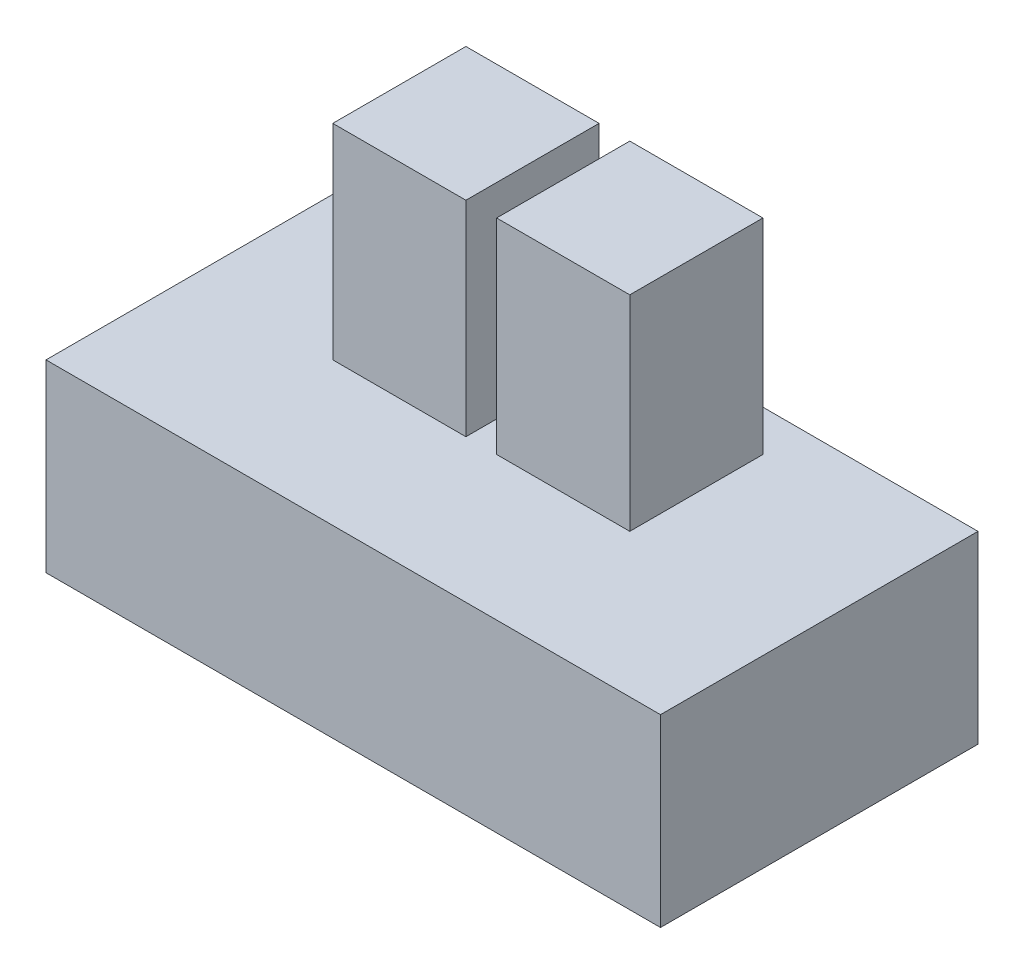
ISO-10303-21;
HEADER;
FILE_DESCRIPTION(('STEP AP214'),'2;1');
FILE_NAME('part.step','',(''),(''),'','','');
FILE_SCHEMA(('AUTOMOTIVE_DESIGN { 1 0 10303 214 1 1 1 1 }'));
ENDSEC;
DATA;
#1=APPLICATION_CONTEXT('core data for automotive mechanical design processes');
#2=APPLICATION_PROTOCOL_DEFINITION('international standard','automotive_design',2000,#1);
#3=PRODUCT_CONTEXT('',#1,'mechanical');
#4=PRODUCT('Part','Part','',(#3));
#5=PRODUCT_RELATED_PRODUCT_CATEGORY('part','',(#4));
#6=PRODUCT_DEFINITION_FORMATION('','',#4);
#7=PRODUCT_DEFINITION_CONTEXT('part definition',#1,'design');
#8=PRODUCT_DEFINITION('design','',#6,#7);
#9=PRODUCT_DEFINITION_SHAPE('','',#8);
#10=(LENGTH_UNIT() NAMED_UNIT(*) SI_UNIT(.MILLI.,.METRE.));
#11=(NAMED_UNIT(*) PLANE_ANGLE_UNIT() SI_UNIT($,.RADIAN.));
#12=(NAMED_UNIT(*) SI_UNIT($,.STERADIAN.) SOLID_ANGLE_UNIT());
#13=UNCERTAINTY_MEASURE_WITH_UNIT(LENGTH_MEASURE(1.E-05),#10,'distance_accuracy_value','');
#14=(GEOMETRIC_REPRESENTATION_CONTEXT(3) GLOBAL_UNCERTAINTY_ASSIGNED_CONTEXT((#13)) GLOBAL_UNIT_ASSIGNED_CONTEXT((#10,
#11,#12)) REPRESENTATION_CONTEXT('',''));
#15=CARTESIAN_POINT('',(0.,0.,0.));
#16=DIRECTION('',(0.,0.,1.));
#17=DIRECTION('',(1.,0.,0.));
#18=AXIS2_PLACEMENT_3D('',#15,#16,#17);
#19=CARTESIAN_POINT('',(0.,18.,0.));
#20=DIRECTION('',(0.,1.,0.));
#21=DIRECTION('',(0.,0.,1.));
#22=AXIS2_PLACEMENT_3D('',#19,#20,#21);
#23=PLANE('',#22);
#24=DIRECTION('',(1.,0.,0.));
#25=VECTOR('',#24,1.);
#26=CARTESIAN_POINT('',(-26.8070343531532,18.,8.11477990751526));
#27=LINE('',#26,#25);
#28=CARTESIAN_POINT('',(-26.8070343531532,18.,8.11477990751526));
#29=VERTEX_POINT('',#28);
#30=CARTESIAN_POINT('',(-13.8070343531532,18.,8.11477990751526));
#31=VERTEX_POINT('',#30);
#32=EDGE_CURVE('E395',#29,#31,#27,.T.);
#33=ORIENTED_EDGE('',*,*,#32,.F.);
#34=DIRECTION('',(0.,0.,1.));
#35=VECTOR('',#34,1.);
#36=CARTESIAN_POINT('',(-26.8070343531532,18.,-4.88522009248474));
#37=LINE('',#36,#35);
#38=CARTESIAN_POINT('',(-26.8070343531532,18.,-4.88522009248474));
#39=VERTEX_POINT('',#38);
#40=EDGE_CURVE('E381',#39,#29,#37,.T.);
#41=ORIENTED_EDGE('',*,*,#40,.F.);
#42=DIRECTION('',(-1.,0.,0.));
#43=VECTOR('',#42,1.);
#44=CARTESIAN_POINT('',(-26.8070343531532,18.,-4.88522009248474));
#45=LINE('',#44,#43);
#46=CARTESIAN_POINT('',(-13.8070343531532,18.,-4.88522009248474));
#47=VERTEX_POINT('',#46);
#48=EDGE_CURVE('E386',#47,#39,#45,.T.);
#49=ORIENTED_EDGE('',*,*,#48,.F.);
#50=DIRECTION('',(0.,0.,-1.));
#51=VECTOR('',#50,1.);
#52=CARTESIAN_POINT('',(-13.8070343531532,18.,-4.88522009248474));
#53=LINE('',#52,#51);
#54=EDGE_CURVE('E397',#31,#47,#53,.T.);
#55=ORIENTED_EDGE('',*,*,#54,.F.);
#56=EDGE_LOOP('',(#33,#41,#49,#55));
#57=FACE_BOUND('',#56,.T.);
#58=DIRECTION('',(0.,0.,1.));
#59=VECTOR('',#58,1.);
#60=CARTESIAN_POINT('',(-40.8070343531532,18.,-8.88522009248474));
#61=LINE('',#60,#59);
#62=CARTESIAN_POINT('',(-40.8070343531532,18.,-8.88522009248474));
#63=VERTEX_POINT('',#62);
#64=CARTESIAN_POINT('',(-40.8070343531532,18.,22.1147799075153));
#65=VERTEX_POINT('',#64);
#66=EDGE_CURVE('E411',#63,#65,#61,.T.);
#67=ORIENTED_EDGE('',*,*,#66,.T.);
#68=DIRECTION('',(1.,0.,0.));
#69=VECTOR('',#68,1.);
#70=CARTESIAN_POINT('',(-40.8070343531532,18.,22.1147799075153));
#71=LINE('',#70,#69);
#72=CARTESIAN_POINT('',(19.1929656468468,18.,22.1147799075153));
#73=VERTEX_POINT('',#72);
#74=EDGE_CURVE('E414',#65,#73,#71,.T.);
#75=ORIENTED_EDGE('',*,*,#74,.T.);
#76=DIRECTION('',(0.,0.,-1.));
#77=VECTOR('',#76,1.);
#78=CARTESIAN_POINT('',(19.1929656468468,18.,-8.88522009248474));
#79=LINE('',#78,#77);
#80=CARTESIAN_POINT('',(19.1929656468468,18.,-8.88522009248474));
#81=VERTEX_POINT('',#80);
#82=EDGE_CURVE('E417',#73,#81,#79,.T.);
#83=ORIENTED_EDGE('',*,*,#82,.T.);
#84=DIRECTION('',(-1.,0.,0.));
#85=VECTOR('',#84,1.);
#86=CARTESIAN_POINT('',(-40.8070343531532,18.,-8.88522009248474));
#87=LINE('',#86,#85);
#88=EDGE_CURVE('E419',#81,#63,#87,.T.);
#89=ORIENTED_EDGE('',*,*,#88,.T.);
#90=EDGE_LOOP('',(#67,#75,#83,#89));
#91=FACE_BOUND('',#90,.T.);
#92=DIRECTION('',(1.,0.,0.));
#93=VECTOR('',#92,1.);
#94=CARTESIAN_POINT('',(-10.8070343531532,18.,8.11477990751526));
#95=LINE('',#94,#93);
#96=CARTESIAN_POINT('',(-10.8070343531532,18.,8.11477990751526));
#97=VERTEX_POINT('',#96);
#98=CARTESIAN_POINT('',(2.19296564684683,18.,8.11477990751526));
#99=VERTEX_POINT('',#98);
#100=EDGE_CURVE('E366',#97,#99,#95,.T.);
#101=ORIENTED_EDGE('',*,*,#100,.F.);
#102=DIRECTION('',(0.,0.,1.));
#103=VECTOR('',#102,1.);
#104=CARTESIAN_POINT('',(-10.8070343531532,18.,-4.88522009248474));
#105=LINE('',#104,#103);
#106=CARTESIAN_POINT('',(-10.8070343531532,18.,-4.88522009248474));
#107=VERTEX_POINT('',#106);
#108=EDGE_CURVE('E346',#107,#97,#105,.T.);
#109=ORIENTED_EDGE('',*,*,#108,.F.);
#110=DIRECTION('',(-1.,0.,0.));
#111=VECTOR('',#110,1.);
#112=CARTESIAN_POINT('',(-10.8070343531532,18.,-4.88522009248474));
#113=LINE('',#112,#111);
#114=CARTESIAN_POINT('',(2.19296564684683,18.,-4.88522009248474));
#115=VERTEX_POINT('',#114);
#116=EDGE_CURVE('E357',#115,#107,#113,.T.);
#117=ORIENTED_EDGE('',*,*,#116,.F.);
#118=DIRECTION('',(0.,0.,-1.));
#119=VECTOR('',#118,1.);
#120=CARTESIAN_POINT('',(2.19296564684683,18.,-4.88522009248474));
#121=LINE('',#120,#119);
#122=EDGE_CURVE('E368',#99,#115,#121,.T.);
#123=ORIENTED_EDGE('',*,*,#122,.F.);
#124=EDGE_LOOP('',(#101,#109,#117,#123));
#125=FACE_BOUND('',#124,.T.);
#126=ADVANCED_FACE('F35',(#57,#91,#125),#23,.T.);
#127=CARTESIAN_POINT('',(-40.8070343531532,18.,-8.88522009248474));
#128=DIRECTION('',(1.,0.,0.));
#129=DIRECTION('',(0.,0.,-1.));
#130=AXIS2_PLACEMENT_3D('',#127,#128,#129);
#131=PLANE('',#130);
#132=DIRECTION('',(0.,0.,1.));
#133=VECTOR('',#132,1.);
#134=CARTESIAN_POINT('',(-40.8070343531532,6.,14.6147799075153));
#135=LINE('',#134,#133);
#136=CARTESIAN_POINT('',(-40.8070343531532,6.,14.6147799075153));
#137=VERTEX_POINT('',#136);
#138=CARTESIAN_POINT('',(-40.8070343531532,6.,17.6147799075153));
#139=VERTEX_POINT('',#138);
#140=EDGE_CURVE('E249',#137,#139,#135,.T.);
#141=ORIENTED_EDGE('',*,*,#140,.F.);
#142=DIRECTION('',(0.,-1.,0.));
#143=VECTOR('',#142,1.);
#144=CARTESIAN_POINT('',(-40.8070343531532,9.,14.6147799075153));
#145=LINE('',#144,#143);
#146=CARTESIAN_POINT('',(-40.8070343531532,9.,14.6147799075153));
#147=VERTEX_POINT('',#146);
#148=EDGE_CURVE('E50',#147,#137,#145,.T.);
#149=ORIENTED_EDGE('',*,*,#148,.F.);
#150=DIRECTION('',(0.,0.,-1.));
#151=VECTOR('',#150,1.);
#152=CARTESIAN_POINT('',(-40.8070343531532,9.,14.6147799075153));
#153=LINE('',#152,#151);
#154=CARTESIAN_POINT('',(-40.8070343531532,9.,17.6147799075153));
#155=VERTEX_POINT('',#154);
#156=EDGE_CURVE('E240',#155,#147,#153,.T.);
#157=ORIENTED_EDGE('',*,*,#156,.F.);
#158=DIRECTION('',(0.,1.,0.));
#159=VECTOR('',#158,1.);
#160=CARTESIAN_POINT('',(-40.8070343531532,9.,17.6147799075153));
#161=LINE('',#160,#159);
#162=EDGE_CURVE('E243',#139,#155,#161,.T.);
#163=ORIENTED_EDGE('',*,*,#162,.F.);
#164=EDGE_LOOP('',(#141,#149,#157,#163));
#165=FACE_BOUND('',#164,.T.);
#166=DIRECTION('',(0.,0.,1.));
#167=VECTOR('',#166,1.);
#168=CARTESIAN_POINT('',(-40.8070343531532,6.,9.11477990751526));
#169=LINE('',#168,#167);
#170=CARTESIAN_POINT('',(-40.8070343531532,6.,9.11477990751526));
#171=VERTEX_POINT('',#170);
#172=CARTESIAN_POINT('',(-40.8070343531532,6.,12.1147799075153));
#173=VERTEX_POINT('',#172);
#174=EDGE_CURVE('E273',#171,#173,#169,.T.);
#175=ORIENTED_EDGE('',*,*,#174,.F.);
#176=DIRECTION('',(0.,-1.,0.));
#177=VECTOR('',#176,1.);
#178=CARTESIAN_POINT('',(-40.8070343531532,9.,9.11477990751526));
#179=LINE('',#178,#177);
#180=CARTESIAN_POINT('',(-40.8070343531532,9.,9.11477990751526));
#181=VERTEX_POINT('',#180);
#182=EDGE_CURVE('E58',#181,#171,#179,.T.);
#183=ORIENTED_EDGE('',*,*,#182,.F.);
#184=DIRECTION('',(0.,0.,-1.));
#185=VECTOR('',#184,1.);
#186=CARTESIAN_POINT('',(-40.8070343531532,9.,9.11477990751526));
#187=LINE('',#186,#185);
#188=CARTESIAN_POINT('',(-40.8070343531532,9.,12.1147799075153));
#189=VERTEX_POINT('',#188);
#190=EDGE_CURVE('E262',#189,#181,#187,.T.);
#191=ORIENTED_EDGE('',*,*,#190,.F.);
#192=DIRECTION('',(0.,1.,0.));
#193=VECTOR('',#192,1.);
#194=CARTESIAN_POINT('',(-40.8070343531532,9.,12.1147799075153));
#195=LINE('',#194,#193);
#196=EDGE_CURVE('E276',#173,#189,#195,.T.);
#197=ORIENTED_EDGE('',*,*,#196,.F.);
#198=EDGE_LOOP('',(#175,#183,#191,#197));
#199=FACE_BOUND('',#198,.T.);
#200=DIRECTION('',(0.,0.,1.));
#201=VECTOR('',#200,1.);
#202=CARTESIAN_POINT('',(-40.8070343531532,6.,1.11477990751526));
#203=LINE('',#202,#201);
#204=CARTESIAN_POINT('',(-40.8070343531532,6.,1.11477990751526));
#205=VERTEX_POINT('',#204);
#206=CARTESIAN_POINT('',(-40.8070343531532,6.,4.11477990751526));
#207=VERTEX_POINT('',#206);
#208=EDGE_CURVE('E304',#205,#207,#203,.T.);
#209=ORIENTED_EDGE('',*,*,#208,.F.);
#210=DIRECTION('',(0.,-1.,0.));
#211=VECTOR('',#210,1.);
#212=CARTESIAN_POINT('',(-40.8070343531532,9.,1.11477990751526));
#213=LINE('',#212,#211);
#214=CARTESIAN_POINT('',(-40.8070343531532,9.,1.11477990751526));
#215=VERTEX_POINT('',#214);
#216=EDGE_CURVE('E283',#215,#205,#213,.T.);
#217=ORIENTED_EDGE('',*,*,#216,.F.);
#218=DIRECTION('',(0.,0.,-1.));
#219=VECTOR('',#218,1.);
#220=CARTESIAN_POINT('',(-40.8070343531532,9.,1.11477990751526));
#221=LINE('',#220,#219);
#222=CARTESIAN_POINT('',(-40.8070343531532,9.,4.11477990751526));
#223=VERTEX_POINT('',#222);
#224=EDGE_CURVE('E293',#223,#215,#221,.T.);
#225=ORIENTED_EDGE('',*,*,#224,.F.);
#226=DIRECTION('',(0.,1.,0.));
#227=VECTOR('',#226,1.);
#228=CARTESIAN_POINT('',(-40.8070343531532,9.,4.11477990751526));
#229=LINE('',#228,#227);
#230=EDGE_CURVE('E307',#207,#223,#229,.T.);
#231=ORIENTED_EDGE('',*,*,#230,.F.);
#232=EDGE_LOOP('',(#209,#217,#225,#231));
#233=FACE_BOUND('',#232,.T.);
#234=DIRECTION('',(0.,0.,1.));
#235=VECTOR('',#234,1.);
#236=CARTESIAN_POINT('',(-40.8070343531532,6.,-4.38522009248475));
#237=LINE('',#236,#235);
#238=CARTESIAN_POINT('',(-40.8070343531532,6.,-4.38522009248475));
#239=VERTEX_POINT('',#238);
#240=CARTESIAN_POINT('',(-40.8070343531532,6.,-1.38522009248474));
#241=VERTEX_POINT('',#240);
#242=EDGE_CURVE('E336',#239,#241,#237,.T.);
#243=ORIENTED_EDGE('',*,*,#242,.F.);
#244=DIRECTION('',(0.,-1.,0.));
#245=VECTOR('',#244,1.);
#246=CARTESIAN_POINT('',(-40.8070343531532,9.,-4.38522009248475));
#247=LINE('',#246,#245);
#248=CARTESIAN_POINT('',(-40.8070343531532,9.,-4.38522009248475));
#249=VERTEX_POINT('',#248);
#250=EDGE_CURVE('E314',#249,#239,#247,.T.);
#251=ORIENTED_EDGE('',*,*,#250,.F.);
#252=DIRECTION('',(0.,0.,-1.));
#253=VECTOR('',#252,1.);
#254=CARTESIAN_POINT('',(-40.8070343531532,9.,-4.38522009248475));
#255=LINE('',#254,#253);
#256=CARTESIAN_POINT('',(-40.8070343531532,9.,-1.38522009248474));
#257=VERTEX_POINT('',#256);
#258=EDGE_CURVE('E325',#257,#249,#255,.T.);
#259=ORIENTED_EDGE('',*,*,#258,.F.);
#260=DIRECTION('',(0.,1.,0.));
#261=VECTOR('',#260,1.);
#262=CARTESIAN_POINT('',(-40.8070343531532,9.,-1.38522009248474));
#263=LINE('',#262,#261);
#264=EDGE_CURVE('E339',#241,#257,#263,.T.);
#265=ORIENTED_EDGE('',*,*,#264,.F.);
#266=EDGE_LOOP('',(#243,#251,#259,#265));
#267=FACE_BOUND('',#266,.T.);
#268=DIRECTION('',(0.,0.,1.));
#269=VECTOR('',#268,1.);
#270=CARTESIAN_POINT('',(-40.8070343531532,0.,-8.88522009248474));
#271=LINE('',#270,#269);
#272=CARTESIAN_POINT('',(-40.8070343531532,0.,-8.88522009248474));
#273=VERTEX_POINT('',#272);
#274=CARTESIAN_POINT('',(-40.8070343531532,0.,22.1147799075153));
#275=VERTEX_POINT('',#274);
#276=EDGE_CURVE('E410',#273,#275,#271,.T.);
#277=ORIENTED_EDGE('',*,*,#276,.T.);
#278=DIRECTION('',(0.,-1.,0.));
#279=VECTOR('',#278,1.);
#280=CARTESIAN_POINT('',(-40.8070343531532,18.,22.1147799075153));
#281=LINE('',#280,#279);
#282=EDGE_CURVE('E11',#65,#275,#281,.T.);
#283=ORIENTED_EDGE('',*,*,#282,.F.);
#284=ORIENTED_EDGE('',*,*,#66,.F.);
#285=DIRECTION('',(0.,-1.,0.));
#286=VECTOR('',#285,1.);
#287=CARTESIAN_POINT('',(-40.8070343531532,18.,-8.88522009248474));
#288=LINE('',#287,#286);
#289=EDGE_CURVE('E421',#63,#273,#288,.T.);
#290=ORIENTED_EDGE('',*,*,#289,.T.);
#291=EDGE_LOOP('',(#277,#283,#284,#290));
#292=FACE_BOUND('',#291,.T.);
#293=ADVANCED_FACE('F37',(#165,#199,#233,#267,#292),#131,.F.);
#294=CARTESIAN_POINT('',(-40.8070343531532,18.,22.1147799075153));
#295=DIRECTION('',(0.,0.,-1.));
#296=DIRECTION('',(-1.,0.,0.));
#297=AXIS2_PLACEMENT_3D('',#294,#295,#296);
#298=PLANE('',#297);
#299=DIRECTION('',(1.,0.,0.));
#300=VECTOR('',#299,1.);
#301=CARTESIAN_POINT('',(-40.8070343531532,0.,22.1147799075153));
#302=LINE('',#301,#300);
#303=CARTESIAN_POINT('',(19.1929656468468,0.,22.1147799075153));
#304=VERTEX_POINT('',#303);
#305=EDGE_CURVE('E424',#275,#304,#302,.T.);
#306=ORIENTED_EDGE('',*,*,#305,.T.);
#307=DIRECTION('',(0.,-1.,0.));
#308=VECTOR('',#307,1.);
#309=CARTESIAN_POINT('',(19.1929656468468,18.,22.1147799075153));
#310=LINE('',#309,#308);
#311=EDGE_CURVE('E43',#73,#304,#310,.T.);
#312=ORIENTED_EDGE('',*,*,#311,.F.);
#313=ORIENTED_EDGE('',*,*,#74,.F.);
#314=ORIENTED_EDGE('',*,*,#282,.T.);
#315=EDGE_LOOP('',(#306,#312,#313,#314));
#316=FACE_BOUND('',#315,.T.);
#317=ADVANCED_FACE('F454',(#316),#298,.F.);
#318=CARTESIAN_POINT('',(19.1929656468468,18.,-8.88522009248474));
#319=DIRECTION('',(-1.,0.,0.));
#320=DIRECTION('',(0.,0.,1.));
#321=AXIS2_PLACEMENT_3D('',#318,#319,#320);
#322=PLANE('',#321);
#323=DIRECTION('',(0.,0.,-1.));
#324=VECTOR('',#323,1.);
#325=CARTESIAN_POINT('',(19.1929656468468,0.,-8.88522009248474));
#326=LINE('',#325,#324);
#327=CARTESIAN_POINT('',(19.1929656468468,0.,-8.88522009248474));
#328=VERTEX_POINT('',#327);
#329=EDGE_CURVE('E426',#304,#328,#326,.T.);
#330=ORIENTED_EDGE('',*,*,#329,.T.);
#331=DIRECTION('',(0.,-1.,0.));
#332=VECTOR('',#331,1.);
#333=CARTESIAN_POINT('',(19.1929656468468,18.,-8.88522009248474));
#334=LINE('',#333,#332);
#335=EDGE_CURVE('E431',#81,#328,#334,.T.);
#336=ORIENTED_EDGE('',*,*,#335,.F.);
#337=ORIENTED_EDGE('',*,*,#82,.F.);
#338=ORIENTED_EDGE('',*,*,#311,.T.);
#339=EDGE_LOOP('',(#330,#336,#337,#338));
#340=FACE_BOUND('',#339,.T.);
#341=ADVANCED_FACE('F438',(#340),#322,.F.);
#342=CARTESIAN_POINT('',(-40.8070343531532,18.,-8.88522009248474));
#343=DIRECTION('',(0.,0.,1.));
#344=DIRECTION('',(1.,0.,0.));
#345=AXIS2_PLACEMENT_3D('',#342,#343,#344);
#346=PLANE('',#345);
#347=DIRECTION('',(-1.,0.,0.));
#348=VECTOR('',#347,1.);
#349=CARTESIAN_POINT('',(-40.8070343531532,0.,-8.88522009248474));
#350=LINE('',#349,#348);
#351=EDGE_CURVE('E415',#328,#273,#350,.T.);
#352=ORIENTED_EDGE('',*,*,#351,.T.);
#353=ORIENTED_EDGE('',*,*,#289,.F.);
#354=ORIENTED_EDGE('',*,*,#88,.F.);
#355=ORIENTED_EDGE('',*,*,#335,.T.);
#356=EDGE_LOOP('',(#352,#353,#354,#355));
#357=FACE_BOUND('',#356,.T.);
#358=ADVANCED_FACE('F447',(#357),#346,.F.);
#359=CARTESIAN_POINT('',(0.,0.,0.));
#360=DIRECTION('',(0.,1.,0.));
#361=DIRECTION('',(0.,0.,1.));
#362=AXIS2_PLACEMENT_3D('',#359,#360,#361);
#363=PLANE('',#362);
#364=ORIENTED_EDGE('',*,*,#276,.F.);
#365=ORIENTED_EDGE('',*,*,#351,.F.);
#366=ORIENTED_EDGE('',*,*,#329,.F.);
#367=ORIENTED_EDGE('',*,*,#305,.F.);
#368=EDGE_LOOP('',(#364,#365,#366,#367));
#369=FACE_BOUND('',#368,.T.);
#370=ADVANCED_FACE('F444',(#369),#363,.F.);
#371=CARTESIAN_POINT('',(-26.8070343531532,38.,-4.88522009248474));
#372=DIRECTION('',(1.,0.,0.));
#373=DIRECTION('',(0.,0.,-1.));
#374=AXIS2_PLACEMENT_3D('',#371,#372,#373);
#375=PLANE('',#374);
#376=ORIENTED_EDGE('',*,*,#40,.T.);
#377=DIRECTION('',(0.,-1.,0.));
#378=VECTOR('',#377,1.);
#379=CARTESIAN_POINT('',(-26.8070343531532,38.,8.11477990751526));
#380=LINE('',#379,#378);
#381=CARTESIAN_POINT('',(-26.8070343531532,38.,8.11477990751526));
#382=VERTEX_POINT('',#381);
#383=EDGE_CURVE('E408',#382,#29,#380,.T.);
#384=ORIENTED_EDGE('',*,*,#383,.F.);
#385=DIRECTION('',(0.,0.,1.));
#386=VECTOR('',#385,1.);
#387=CARTESIAN_POINT('',(-26.8070343531532,38.,-4.88522009248474));
#388=LINE('',#387,#386);
#389=CARTESIAN_POINT('',(-26.8070343531532,38.,-4.88522009248474));
#390=VERTEX_POINT('',#389);
#391=EDGE_CURVE('E382',#390,#382,#388,.T.);
#392=ORIENTED_EDGE('',*,*,#391,.F.);
#393=DIRECTION('',(0.,-1.,0.));
#394=VECTOR('',#393,1.);
#395=CARTESIAN_POINT('',(-26.8070343531532,38.,-4.88522009248474));
#396=LINE('',#395,#394);
#397=EDGE_CURVE('E392',#390,#39,#396,.T.);
#398=ORIENTED_EDGE('',*,*,#397,.T.);
#399=EDGE_LOOP('',(#376,#384,#392,#398));
#400=FACE_BOUND('',#399,.T.);
#401=ADVANCED_FACE('F470',(#400),#375,.F.);
#402=CARTESIAN_POINT('',(-26.8070343531532,38.,8.11477990751526));
#403=DIRECTION('',(0.,0.,-1.));
#404=DIRECTION('',(-1.,0.,0.));
#405=AXIS2_PLACEMENT_3D('',#402,#403,#404);
#406=PLANE('',#405);
#407=ORIENTED_EDGE('',*,*,#32,.T.);
#408=DIRECTION('',(0.,-1.,0.));
#409=VECTOR('',#408,1.);
#410=CARTESIAN_POINT('',(-13.8070343531532,38.,8.11477990751526));
#411=LINE('',#410,#409);
#412=CARTESIAN_POINT('',(-13.8070343531532,38.,8.11477990751526));
#413=VERTEX_POINT('',#412);
#414=EDGE_CURVE('E405',#413,#31,#411,.T.);
#415=ORIENTED_EDGE('',*,*,#414,.F.);
#416=DIRECTION('',(1.,0.,0.));
#417=VECTOR('',#416,1.);
#418=CARTESIAN_POINT('',(-26.8070343531532,38.,8.11477990751526));
#419=LINE('',#418,#417);
#420=EDGE_CURVE('E385',#382,#413,#419,.T.);
#421=ORIENTED_EDGE('',*,*,#420,.F.);
#422=ORIENTED_EDGE('',*,*,#383,.T.);
#423=EDGE_LOOP('',(#407,#415,#421,#422));
#424=FACE_BOUND('',#423,.T.);
#425=ADVANCED_FACE('F489',(#424),#406,.F.);
#426=CARTESIAN_POINT('',(-13.8070343531532,38.,-4.88522009248474));
#427=DIRECTION('',(-1.,0.,0.));
#428=DIRECTION('',(0.,0.,1.));
#429=AXIS2_PLACEMENT_3D('',#426,#427,#428);
#430=PLANE('',#429);
#431=ORIENTED_EDGE('',*,*,#54,.T.);
#432=DIRECTION('',(0.,-1.,0.));
#433=VECTOR('',#432,1.);
#434=CARTESIAN_POINT('',(-13.8070343531532,38.,-4.88522009248474));
#435=LINE('',#434,#433);
#436=CARTESIAN_POINT('',(-13.8070343531532,38.,-4.88522009248474));
#437=VERTEX_POINT('',#436);
#438=EDGE_CURVE('E403',#437,#47,#435,.T.);
#439=ORIENTED_EDGE('',*,*,#438,.F.);
#440=DIRECTION('',(0.,0.,-1.));
#441=VECTOR('',#440,1.);
#442=CARTESIAN_POINT('',(-13.8070343531532,38.,-4.88522009248474));
#443=LINE('',#442,#441);
#444=EDGE_CURVE('E388',#413,#437,#443,.T.);
#445=ORIENTED_EDGE('',*,*,#444,.F.);
#446=ORIENTED_EDGE('',*,*,#414,.T.);
#447=EDGE_LOOP('',(#431,#439,#445,#446));
#448=FACE_BOUND('',#447,.T.);
#449=ADVANCED_FACE('F497',(#448),#430,.F.);
#450=CARTESIAN_POINT('',(-26.8070343531532,38.,-4.88522009248474));
#451=DIRECTION('',(0.,0.,1.));
#452=DIRECTION('',(1.,0.,0.));
#453=AXIS2_PLACEMENT_3D('',#450,#451,#452);
#454=PLANE('',#453);
#455=ORIENTED_EDGE('',*,*,#48,.T.);
#456=ORIENTED_EDGE('',*,*,#397,.F.);
#457=DIRECTION('',(-1.,0.,0.));
#458=VECTOR('',#457,1.);
#459=CARTESIAN_POINT('',(-26.8070343531532,38.,-4.88522009248474));
#460=LINE('',#459,#458);
#461=EDGE_CURVE('E390',#437,#390,#460,.T.);
#462=ORIENTED_EDGE('',*,*,#461,.F.);
#463=ORIENTED_EDGE('',*,*,#438,.T.);
#464=EDGE_LOOP('',(#455,#456,#462,#463));
#465=FACE_BOUND('',#464,.T.);
#466=ADVANCED_FACE('F505',(#465),#454,.F.);
#467=CARTESIAN_POINT('',(0.,38.,0.));
#468=DIRECTION('',(0.,1.,0.));
#469=DIRECTION('',(0.,0.,1.));
#470=AXIS2_PLACEMENT_3D('',#467,#468,#469);
#471=PLANE('',#470);
#472=ORIENTED_EDGE('',*,*,#391,.T.);
#473=ORIENTED_EDGE('',*,*,#420,.T.);
#474=ORIENTED_EDGE('',*,*,#444,.T.);
#475=ORIENTED_EDGE('',*,*,#461,.T.);
#476=EDGE_LOOP('',(#472,#473,#474,#475));
#477=FACE_BOUND('',#476,.T.);
#478=ADVANCED_FACE('F515',(#477),#471,.T.);
#479=CARTESIAN_POINT('',(-10.8070343531532,38.,-4.88522009248474));
#480=DIRECTION('',(1.,0.,0.));
#481=DIRECTION('',(0.,0.,-1.));
#482=AXIS2_PLACEMENT_3D('',#479,#480,#481);
#483=PLANE('',#482);
#484=ORIENTED_EDGE('',*,*,#108,.T.);
#485=DIRECTION('',(0.,-1.,0.));
#486=VECTOR('',#485,1.);
#487=CARTESIAN_POINT('',(-10.8070343531532,38.,8.11477990751526));
#488=LINE('',#487,#486);
#489=CARTESIAN_POINT('',(-10.8070343531532,38.,8.11477990751526));
#490=VERTEX_POINT('',#489);
#491=EDGE_CURVE('E379',#490,#97,#488,.T.);
#492=ORIENTED_EDGE('',*,*,#491,.F.);
#493=DIRECTION('',(0.,0.,1.));
#494=VECTOR('',#493,1.);
#495=CARTESIAN_POINT('',(-10.8070343531532,38.,-4.88522009248474));
#496=LINE('',#495,#494);
#497=CARTESIAN_POINT('',(-10.8070343531532,38.,-4.88522009248474));
#498=VERTEX_POINT('',#497);
#499=EDGE_CURVE('E353',#498,#490,#496,.T.);
#500=ORIENTED_EDGE('',*,*,#499,.F.);
#501=DIRECTION('',(0.,-1.,0.));
#502=VECTOR('',#501,1.);
#503=CARTESIAN_POINT('',(-10.8070343531532,38.,-4.88522009248474));
#504=LINE('',#503,#502);
#505=EDGE_CURVE('E363',#498,#107,#504,.T.);
#506=ORIENTED_EDGE('',*,*,#505,.T.);
#507=EDGE_LOOP('',(#484,#492,#500,#506));
#508=FACE_BOUND('',#507,.T.);
#509=ADVANCED_FACE('F523',(#508),#483,.F.);
#510=CARTESIAN_POINT('',(-10.8070343531532,38.,8.11477990751526));
#511=DIRECTION('',(0.,0.,-1.));
#512=DIRECTION('',(-1.,0.,0.));
#513=AXIS2_PLACEMENT_3D('',#510,#511,#512);
#514=PLANE('',#513);
#515=ORIENTED_EDGE('',*,*,#100,.T.);
#516=DIRECTION('',(0.,-1.,0.));
#517=VECTOR('',#516,1.);
#518=CARTESIAN_POINT('',(2.19296564684683,38.,8.11477990751526));
#519=LINE('',#518,#517);
#520=CARTESIAN_POINT('',(2.19296564684683,38.,8.11477990751526));
#521=VERTEX_POINT('',#520);
#522=EDGE_CURVE('E376',#521,#99,#519,.T.);
#523=ORIENTED_EDGE('',*,*,#522,.F.);
#524=DIRECTION('',(1.,0.,0.));
#525=VECTOR('',#524,1.);
#526=CARTESIAN_POINT('',(-10.8070343531532,38.,8.11477990751526));
#527=LINE('',#526,#525);
#528=EDGE_CURVE('E356',#490,#521,#527,.T.);
#529=ORIENTED_EDGE('',*,*,#528,.F.);
#530=ORIENTED_EDGE('',*,*,#491,.T.);
#531=EDGE_LOOP('',(#515,#523,#529,#530));
#532=FACE_BOUND('',#531,.T.);
#533=ADVANCED_FACE('F530',(#532),#514,.F.);
#534=CARTESIAN_POINT('',(2.19296564684683,38.,-4.88522009248474));
#535=DIRECTION('',(-1.,0.,0.));
#536=DIRECTION('',(0.,0.,1.));
#537=AXIS2_PLACEMENT_3D('',#534,#535,#536);
#538=PLANE('',#537);
#539=ORIENTED_EDGE('',*,*,#122,.T.);
#540=DIRECTION('',(0.,-1.,0.));
#541=VECTOR('',#540,1.);
#542=CARTESIAN_POINT('',(2.19296564684683,38.,-4.88522009248474));
#543=LINE('',#542,#541);
#544=CARTESIAN_POINT('',(2.19296564684683,38.,-4.88522009248474));
#545=VERTEX_POINT('',#544);
#546=EDGE_CURVE('E374',#545,#115,#543,.T.);
#547=ORIENTED_EDGE('',*,*,#546,.F.);
#548=DIRECTION('',(0.,0.,-1.));
#549=VECTOR('',#548,1.);
#550=CARTESIAN_POINT('',(2.19296564684683,38.,-4.88522009248474));
#551=LINE('',#550,#549);
#552=EDGE_CURVE('E359',#521,#545,#551,.T.);
#553=ORIENTED_EDGE('',*,*,#552,.F.);
#554=ORIENTED_EDGE('',*,*,#522,.T.);
#555=EDGE_LOOP('',(#539,#547,#553,#554));
#556=FACE_BOUND('',#555,.T.);
#557=ADVANCED_FACE('F537',(#556),#538,.F.);
#558=CARTESIAN_POINT('',(-10.8070343531532,38.,-4.88522009248474));
#559=DIRECTION('',(0.,0.,1.));
#560=DIRECTION('',(1.,0.,0.));
#561=AXIS2_PLACEMENT_3D('',#558,#559,#560);
#562=PLANE('',#561);
#563=ORIENTED_EDGE('',*,*,#116,.T.);
#564=ORIENTED_EDGE('',*,*,#505,.F.);
#565=DIRECTION('',(-1.,0.,0.));
#566=VECTOR('',#565,1.);
#567=CARTESIAN_POINT('',(-10.8070343531532,38.,-4.88522009248474));
#568=LINE('',#567,#566);
#569=EDGE_CURVE('E361',#545,#498,#568,.T.);
#570=ORIENTED_EDGE('',*,*,#569,.F.);
#571=ORIENTED_EDGE('',*,*,#546,.T.);
#572=EDGE_LOOP('',(#563,#564,#570,#571));
#573=FACE_BOUND('',#572,.T.);
#574=ADVANCED_FACE('F545',(#573),#562,.F.);
#575=CARTESIAN_POINT('',(0.,38.,0.));
#576=DIRECTION('',(0.,1.,0.));
#577=DIRECTION('',(0.,0.,1.));
#578=AXIS2_PLACEMENT_3D('',#575,#576,#577);
#579=PLANE('',#578);
#580=ORIENTED_EDGE('',*,*,#499,.T.);
#581=ORIENTED_EDGE('',*,*,#528,.T.);
#582=ORIENTED_EDGE('',*,*,#552,.T.);
#583=ORIENTED_EDGE('',*,*,#569,.T.);
#584=EDGE_LOOP('',(#580,#581,#582,#583));
#585=FACE_BOUND('',#584,.T.);
#586=ADVANCED_FACE('F552',(#585),#579,.T.);
#587=CARTESIAN_POINT('',(-35.8070343531532,9.,-4.38522009248475));
#588=DIRECTION('',(0.,0.,-1.));
#589=DIRECTION('',(-1.,0.,0.));
#590=AXIS2_PLACEMENT_3D('',#587,#588,#589);
#591=PLANE('',#590);
#592=ORIENTED_EDGE('',*,*,#250,.T.);
#593=DIRECTION('',(-1.,0.,0.));
#594=VECTOR('',#593,1.);
#595=CARTESIAN_POINT('',(-35.8070343531532,6.,-4.38522009248475));
#596=LINE('',#595,#594);
#597=CARTESIAN_POINT('',(-35.8070343531532,6.,-4.38522009248475));
#598=VERTEX_POINT('',#597);
#599=EDGE_CURVE('E334',#598,#239,#596,.T.);
#600=ORIENTED_EDGE('',*,*,#599,.F.);
#601=DIRECTION('',(0.,-1.,0.));
#602=VECTOR('',#601,1.);
#603=CARTESIAN_POINT('',(-35.8070343531532,9.,-4.38522009248475));
#604=LINE('',#603,#602);
#605=CARTESIAN_POINT('',(-35.8070343531532,9.,-4.38522009248475));
#606=VERTEX_POINT('',#605);
#607=EDGE_CURVE('E321',#606,#598,#604,.T.);
#608=ORIENTED_EDGE('',*,*,#607,.F.);
#609=DIRECTION('',(-1.,0.,0.));
#610=VECTOR('',#609,1.);
#611=CARTESIAN_POINT('',(-35.8070343531532,9.,-4.38522009248475));
#612=LINE('',#611,#610);
#613=EDGE_CURVE('E344',#606,#249,#612,.T.);
#614=ORIENTED_EDGE('',*,*,#613,.T.);
#615=EDGE_LOOP('',(#592,#600,#608,#614));
#616=FACE_BOUND('',#615,.T.);
#617=ADVANCED_FACE('F559',(#616),#591,.F.);
#618=CARTESIAN_POINT('',(-35.8070343531532,9.,-4.38522009248475));
#619=DIRECTION('',(0.,1.,0.));
#620=DIRECTION('',(0.,0.,1.));
#621=AXIS2_PLACEMENT_3D('',#618,#619,#620);
#622=PLANE('',#621);
#623=ORIENTED_EDGE('',*,*,#258,.T.);
#624=ORIENTED_EDGE('',*,*,#613,.F.);
#625=DIRECTION('',(0.,0.,-1.));
#626=VECTOR('',#625,1.);
#627=CARTESIAN_POINT('',(-35.8070343531532,9.,-4.38522009248475));
#628=LINE('',#627,#626);
#629=CARTESIAN_POINT('',(-35.8070343531532,9.,-1.38522009248474));
#630=VERTEX_POINT('',#629);
#631=EDGE_CURVE('E331',#630,#606,#628,.T.);
#632=ORIENTED_EDGE('',*,*,#631,.F.);
#633=DIRECTION('',(-1.,0.,0.));
#634=VECTOR('',#633,1.);
#635=CARTESIAN_POINT('',(-35.8070343531532,9.,-1.38522009248474));
#636=LINE('',#635,#634);
#637=EDGE_CURVE('E347',#630,#257,#636,.T.);
#638=ORIENTED_EDGE('',*,*,#637,.T.);
#639=EDGE_LOOP('',(#623,#624,#632,#638));
#640=FACE_BOUND('',#639,.T.);
#641=ADVANCED_FACE('F567',(#640),#622,.F.);
#642=CARTESIAN_POINT('',(-35.8070343531532,9.,-1.38522009248474));
#643=DIRECTION('',(0.,0.,1.));
#644=DIRECTION('',(0.,-1.,0.));
#645=AXIS2_PLACEMENT_3D('',#642,#643,#644);
#646=PLANE('',#645);
#647=ORIENTED_EDGE('',*,*,#264,.T.);
#648=ORIENTED_EDGE('',*,*,#637,.F.);
#649=DIRECTION('',(0.,1.,0.));
#650=VECTOR('',#649,1.);
#651=CARTESIAN_POINT('',(-35.8070343531532,9.,-1.38522009248474));
#652=LINE('',#651,#650);
#653=CARTESIAN_POINT('',(-35.8070343531532,6.,-1.38522009248474));
#654=VERTEX_POINT('',#653);
#655=EDGE_CURVE('E328',#654,#630,#652,.T.);
#656=ORIENTED_EDGE('',*,*,#655,.F.);
#657=DIRECTION('',(-1.,0.,0.));
#658=VECTOR('',#657,1.);
#659=CARTESIAN_POINT('',(-35.8070343531532,6.,-1.38522009248474));
#660=LINE('',#659,#658);
#661=EDGE_CURVE('E349',#654,#241,#660,.T.);
#662=ORIENTED_EDGE('',*,*,#661,.T.);
#663=EDGE_LOOP('',(#647,#648,#656,#662));
#664=FACE_BOUND('',#663,.T.);
#665=ADVANCED_FACE('F576',(#664),#646,.F.);
#666=CARTESIAN_POINT('',(-35.8070343531532,6.,-4.38522009248475));
#667=DIRECTION('',(0.,-1.,0.));
#668=DIRECTION('',(0.,0.,-1.));
#669=AXIS2_PLACEMENT_3D('',#666,#667,#668);
#670=PLANE('',#669);
#671=ORIENTED_EDGE('',*,*,#242,.T.);
#672=ORIENTED_EDGE('',*,*,#661,.F.);
#673=DIRECTION('',(0.,0.,1.));
#674=VECTOR('',#673,1.);
#675=CARTESIAN_POINT('',(-35.8070343531532,6.,-4.38522009248475));
#676=LINE('',#675,#674);
#677=EDGE_CURVE('E324',#598,#654,#676,.T.);
#678=ORIENTED_EDGE('',*,*,#677,.F.);
#679=ORIENTED_EDGE('',*,*,#599,.T.);
#680=EDGE_LOOP('',(#671,#672,#678,#679));
#681=FACE_BOUND('',#680,.T.);
#682=ADVANCED_FACE('F584',(#681),#670,.F.);
#683=CARTESIAN_POINT('',(-35.8070343531532,0.,0.));
#684=DIRECTION('',(-1.,0.,0.));
#685=DIRECTION('',(0.,0.,1.));
#686=AXIS2_PLACEMENT_3D('',#683,#684,#685);
#687=PLANE('',#686);
#688=ORIENTED_EDGE('',*,*,#607,.T.);
#689=ORIENTED_EDGE('',*,*,#677,.T.);
#690=ORIENTED_EDGE('',*,*,#655,.T.);
#691=ORIENTED_EDGE('',*,*,#631,.T.);
#692=EDGE_LOOP('',(#688,#689,#690,#691));
#693=FACE_BOUND('',#692,.T.);
#694=ADVANCED_FACE('F592',(#693),#687,.T.);
#695=CARTESIAN_POINT('',(-35.8070343531532,9.,1.11477990751526));
#696=DIRECTION('',(0.,0.,-1.));
#697=DIRECTION('',(-1.,0.,0.));
#698=AXIS2_PLACEMENT_3D('',#695,#696,#697);
#699=PLANE('',#698);
#700=ORIENTED_EDGE('',*,*,#216,.T.);
#701=DIRECTION('',(-1.,0.,0.));
#702=VECTOR('',#701,1.);
#703=CARTESIAN_POINT('',(-35.8070343531532,6.,1.11477990751526));
#704=LINE('',#703,#702);
#705=CARTESIAN_POINT('',(-35.8070343531532,6.,1.11477990751526));
#706=VERTEX_POINT('',#705);
#707=EDGE_CURVE('E302',#706,#205,#704,.T.);
#708=ORIENTED_EDGE('',*,*,#707,.F.);
#709=DIRECTION('',(0.,-1.,0.));
#710=VECTOR('',#709,1.);
#711=CARTESIAN_POINT('',(-35.8070343531532,9.,1.11477990751526));
#712=LINE('',#711,#710);
#713=CARTESIAN_POINT('',(-35.8070343531532,9.,1.11477990751526));
#714=VERTEX_POINT('',#713);
#715=EDGE_CURVE('E289',#714,#706,#712,.T.);
#716=ORIENTED_EDGE('',*,*,#715,.F.);
#717=DIRECTION('',(-1.,0.,0.));
#718=VECTOR('',#717,1.);
#719=CARTESIAN_POINT('',(-35.8070343531532,9.,1.11477990751526));
#720=LINE('',#719,#718);
#721=EDGE_CURVE('E312',#714,#215,#720,.T.);
#722=ORIENTED_EDGE('',*,*,#721,.T.);
#723=EDGE_LOOP('',(#700,#708,#716,#722));
#724=FACE_BOUND('',#723,.T.);
#725=ADVANCED_FACE('F600',(#724),#699,.F.);
#726=CARTESIAN_POINT('',(-35.8070343531532,9.,1.11477990751526));
#727=DIRECTION('',(0.,1.,0.));
#728=DIRECTION('',(0.,0.,1.));
#729=AXIS2_PLACEMENT_3D('',#726,#727,#728);
#730=PLANE('',#729);
#731=ORIENTED_EDGE('',*,*,#224,.T.);
#732=ORIENTED_EDGE('',*,*,#721,.F.);
#733=DIRECTION('',(0.,0.,-1.));
#734=VECTOR('',#733,1.);
#735=CARTESIAN_POINT('',(-35.8070343531532,9.,1.11477990751526));
#736=LINE('',#735,#734);
#737=CARTESIAN_POINT('',(-35.8070343531532,9.,4.11477990751526));
#738=VERTEX_POINT('',#737);
#739=EDGE_CURVE('E299',#738,#714,#736,.T.);
#740=ORIENTED_EDGE('',*,*,#739,.F.);
#741=DIRECTION('',(-1.,0.,0.));
#742=VECTOR('',#741,1.);
#743=CARTESIAN_POINT('',(-35.8070343531532,9.,4.11477990751526));
#744=LINE('',#743,#742);
#745=EDGE_CURVE('E315',#738,#223,#744,.T.);
#746=ORIENTED_EDGE('',*,*,#745,.T.);
#747=EDGE_LOOP('',(#731,#732,#740,#746));
#748=FACE_BOUND('',#747,.T.);
#749=ADVANCED_FACE('F608',(#748),#730,.F.);
#750=CARTESIAN_POINT('',(-35.8070343531532,9.,4.11477990751526));
#751=DIRECTION('',(0.,0.,1.));
#752=DIRECTION('',(1.,0.,0.));
#753=AXIS2_PLACEMENT_3D('',#750,#751,#752);
#754=PLANE('',#753);
#755=ORIENTED_EDGE('',*,*,#230,.T.);
#756=ORIENTED_EDGE('',*,*,#745,.F.);
#757=DIRECTION('',(0.,1.,0.));
#758=VECTOR('',#757,1.);
#759=CARTESIAN_POINT('',(-35.8070343531532,9.,4.11477990751526));
#760=LINE('',#759,#758);
#761=CARTESIAN_POINT('',(-35.8070343531532,6.,4.11477990751526));
#762=VERTEX_POINT('',#761);
#763=EDGE_CURVE('E296',#762,#738,#760,.T.);
#764=ORIENTED_EDGE('',*,*,#763,.F.);
#765=DIRECTION('',(-1.,0.,0.));
#766=VECTOR('',#765,1.);
#767=CARTESIAN_POINT('',(-35.8070343531532,6.,4.11477990751526));
#768=LINE('',#767,#766);
#769=EDGE_CURVE('E317',#762,#207,#768,.T.);
#770=ORIENTED_EDGE('',*,*,#769,.T.);
#771=EDGE_LOOP('',(#755,#756,#764,#770));
#772=FACE_BOUND('',#771,.T.);
#773=ADVANCED_FACE('F616',(#772),#754,.F.);
#774=CARTESIAN_POINT('',(-35.8070343531532,6.,1.11477990751526));
#775=DIRECTION('',(0.,-1.,0.));
#776=DIRECTION('',(0.,0.,-1.));
#777=AXIS2_PLACEMENT_3D('',#774,#775,#776);
#778=PLANE('',#777);
#779=ORIENTED_EDGE('',*,*,#208,.T.);
#780=ORIENTED_EDGE('',*,*,#769,.F.);
#781=DIRECTION('',(0.,0.,1.));
#782=VECTOR('',#781,1.);
#783=CARTESIAN_POINT('',(-35.8070343531532,6.,1.11477990751526));
#784=LINE('',#783,#782);
#785=EDGE_CURVE('E292',#706,#762,#784,.T.);
#786=ORIENTED_EDGE('',*,*,#785,.F.);
#787=ORIENTED_EDGE('',*,*,#707,.T.);
#788=EDGE_LOOP('',(#779,#780,#786,#787));
#789=FACE_BOUND('',#788,.T.);
#790=ADVANCED_FACE('F624',(#789),#778,.F.);
#791=CARTESIAN_POINT('',(-35.8070343531532,0.,0.));
#792=DIRECTION('',(-1.,0.,0.));
#793=DIRECTION('',(0.,0.,1.));
#794=AXIS2_PLACEMENT_3D('',#791,#792,#793);
#795=PLANE('',#794);
#796=ORIENTED_EDGE('',*,*,#715,.T.);
#797=ORIENTED_EDGE('',*,*,#785,.T.);
#798=ORIENTED_EDGE('',*,*,#763,.T.);
#799=ORIENTED_EDGE('',*,*,#739,.T.);
#800=EDGE_LOOP('',(#796,#797,#798,#799));
#801=FACE_BOUND('',#800,.T.);
#802=ADVANCED_FACE('F632',(#801),#795,.T.);
#803=CARTESIAN_POINT('',(-35.8070343531532,9.,9.11477990751526));
#804=DIRECTION('',(0.,0.,-1.));
#805=DIRECTION('',(0.,1.,0.));
#806=AXIS2_PLACEMENT_3D('',#803,#804,#805);
#807=PLANE('',#806);
#808=ORIENTED_EDGE('',*,*,#182,.T.);
#809=DIRECTION('',(-1.,0.,0.));
#810=VECTOR('',#809,1.);
#811=CARTESIAN_POINT('',(-35.8070343531532,6.,9.11477990751526));
#812=LINE('',#811,#810);
#813=CARTESIAN_POINT('',(-35.8070343531532,6.,9.11477990751526));
#814=VERTEX_POINT('',#813);
#815=EDGE_CURVE('E271',#814,#171,#812,.T.);
#816=ORIENTED_EDGE('',*,*,#815,.F.);
#817=DIRECTION('',(0.,-1.,0.));
#818=VECTOR('',#817,1.);
#819=CARTESIAN_POINT('',(-35.8070343531532,9.,9.11477990751526));
#820=LINE('',#819,#818);
#821=CARTESIAN_POINT('',(-35.8070343531532,9.,9.11477990751526));
#822=VERTEX_POINT('',#821);
#823=EDGE_CURVE('E258',#822,#814,#820,.T.);
#824=ORIENTED_EDGE('',*,*,#823,.F.);
#825=DIRECTION('',(-1.,0.,0.));
#826=VECTOR('',#825,1.);
#827=CARTESIAN_POINT('',(-35.8070343531532,9.,9.11477990751526));
#828=LINE('',#827,#826);
#829=EDGE_CURVE('E281',#822,#181,#828,.T.);
#830=ORIENTED_EDGE('',*,*,#829,.T.);
#831=EDGE_LOOP('',(#808,#816,#824,#830));
#832=FACE_BOUND('',#831,.T.);
#833=ADVANCED_FACE('F640',(#832),#807,.F.);
#834=CARTESIAN_POINT('',(-35.8070343531532,9.,9.11477990751526));
#835=DIRECTION('',(0.,1.,0.));
#836=DIRECTION('',(0.,0.,1.));
#837=AXIS2_PLACEMENT_3D('',#834,#835,#836);
#838=PLANE('',#837);
#839=ORIENTED_EDGE('',*,*,#190,.T.);
#840=ORIENTED_EDGE('',*,*,#829,.F.);
#841=DIRECTION('',(0.,0.,-1.));
#842=VECTOR('',#841,1.);
#843=CARTESIAN_POINT('',(-35.8070343531532,9.,9.11477990751526));
#844=LINE('',#843,#842);
#845=CARTESIAN_POINT('',(-35.8070343531532,9.,12.1147799075153));
#846=VERTEX_POINT('',#845);
#847=EDGE_CURVE('E268',#846,#822,#844,.T.);
#848=ORIENTED_EDGE('',*,*,#847,.F.);
#849=DIRECTION('',(-1.,0.,0.));
#850=VECTOR('',#849,1.);
#851=CARTESIAN_POINT('',(-35.8070343531532,9.,12.1147799075153));
#852=LINE('',#851,#850);
#853=EDGE_CURVE('E284',#846,#189,#852,.T.);
#854=ORIENTED_EDGE('',*,*,#853,.T.);
#855=EDGE_LOOP('',(#839,#840,#848,#854));
#856=FACE_BOUND('',#855,.T.);
#857=ADVANCED_FACE('F648',(#856),#838,.F.);
#858=CARTESIAN_POINT('',(-35.8070343531532,9.,12.1147799075153));
#859=DIRECTION('',(0.,0.,1.));
#860=DIRECTION('',(0.,-1.,0.));
#861=AXIS2_PLACEMENT_3D('',#858,#859,#860);
#862=PLANE('',#861);
#863=ORIENTED_EDGE('',*,*,#196,.T.);
#864=ORIENTED_EDGE('',*,*,#853,.F.);
#865=DIRECTION('',(0.,1.,0.));
#866=VECTOR('',#865,1.);
#867=CARTESIAN_POINT('',(-35.8070343531532,9.,12.1147799075153));
#868=LINE('',#867,#866);
#869=CARTESIAN_POINT('',(-35.8070343531532,6.,12.1147799075153));
#870=VERTEX_POINT('',#869);
#871=EDGE_CURVE('E265',#870,#846,#868,.T.);
#872=ORIENTED_EDGE('',*,*,#871,.F.);
#873=DIRECTION('',(-1.,0.,0.));
#874=VECTOR('',#873,1.);
#875=CARTESIAN_POINT('',(-35.8070343531532,6.,12.1147799075153));
#876=LINE('',#875,#874);
#877=EDGE_CURVE('E286',#870,#173,#876,.T.);
#878=ORIENTED_EDGE('',*,*,#877,.T.);
#879=EDGE_LOOP('',(#863,#864,#872,#878));
#880=FACE_BOUND('',#879,.T.);
#881=ADVANCED_FACE('F655',(#880),#862,.F.);
#882=CARTESIAN_POINT('',(-35.8070343531532,6.,9.11477990751526));
#883=DIRECTION('',(0.,-1.,0.));
#884=DIRECTION('',(0.,0.,-1.));
#885=AXIS2_PLACEMENT_3D('',#882,#883,#884);
#886=PLANE('',#885);
#887=ORIENTED_EDGE('',*,*,#174,.T.);
#888=ORIENTED_EDGE('',*,*,#877,.F.);
#889=DIRECTION('',(0.,0.,1.));
#890=VECTOR('',#889,1.);
#891=CARTESIAN_POINT('',(-35.8070343531532,6.,9.11477990751526));
#892=LINE('',#891,#890);
#893=EDGE_CURVE('E261',#814,#870,#892,.T.);
#894=ORIENTED_EDGE('',*,*,#893,.F.);
#895=ORIENTED_EDGE('',*,*,#815,.T.);
#896=EDGE_LOOP('',(#887,#888,#894,#895));
#897=FACE_BOUND('',#896,.T.);
#898=ADVANCED_FACE('F663',(#897),#886,.F.);
#899=CARTESIAN_POINT('',(-35.8070343531532,0.,0.));
#900=DIRECTION('',(-1.,0.,0.));
#901=DIRECTION('',(0.,0.,1.));
#902=AXIS2_PLACEMENT_3D('',#899,#900,#901);
#903=PLANE('',#902);
#904=ORIENTED_EDGE('',*,*,#823,.T.);
#905=ORIENTED_EDGE('',*,*,#893,.T.);
#906=ORIENTED_EDGE('',*,*,#871,.T.);
#907=ORIENTED_EDGE('',*,*,#847,.T.);
#908=EDGE_LOOP('',(#904,#905,#906,#907));
#909=FACE_BOUND('',#908,.T.);
#910=ADVANCED_FACE('F671',(#909),#903,.T.);
#911=CARTESIAN_POINT('',(-35.8070343531532,9.,14.6147799075153));
#912=DIRECTION('',(0.,0.,-1.));
#913=DIRECTION('',(0.,1.,0.));
#914=AXIS2_PLACEMENT_3D('',#911,#912,#913);
#915=PLANE('',#914);
#916=ORIENTED_EDGE('',*,*,#148,.T.);
#917=DIRECTION('',(-1.,0.,0.));
#918=VECTOR('',#917,1.);
#919=CARTESIAN_POINT('',(-35.8070343531532,6.,14.6147799075153));
#920=LINE('',#919,#918);
#921=CARTESIAN_POINT('',(-35.8070343531532,6.,14.6147799075153));
#922=VERTEX_POINT('',#921);
#923=EDGE_CURVE('E218',#922,#137,#920,.T.);
#924=ORIENTED_EDGE('',*,*,#923,.F.);
#925=DIRECTION('',(0.,-1.,0.));
#926=VECTOR('',#925,1.);
#927=CARTESIAN_POINT('',(-35.8070343531532,9.,14.6147799075153));
#928=LINE('',#927,#926);
#929=CARTESIAN_POINT('',(-35.8070343531532,9.,14.6147799075153));
#930=VERTEX_POINT('',#929);
#931=EDGE_CURVE('E222',#930,#922,#928,.T.);
#932=ORIENTED_EDGE('',*,*,#931,.F.);
#933=DIRECTION('',(-1.,0.,0.));
#934=VECTOR('',#933,1.);
#935=CARTESIAN_POINT('',(-35.8070343531532,9.,14.6147799075153));
#936=LINE('',#935,#934);
#937=EDGE_CURVE('E253',#930,#147,#936,.T.);
#938=ORIENTED_EDGE('',*,*,#937,.T.);
#939=EDGE_LOOP('',(#916,#924,#932,#938));
#940=FACE_BOUND('',#939,.T.);
#941=ADVANCED_FACE('F220',(#940),#915,.F.);
#942=CARTESIAN_POINT('',(-35.8070343531532,9.,14.6147799075153));
#943=DIRECTION('',(0.,1.,0.));
#944=DIRECTION('',(0.,0.,1.));
#945=AXIS2_PLACEMENT_3D('',#942,#943,#944);
#946=PLANE('',#945);
#947=ORIENTED_EDGE('',*,*,#156,.T.);
#948=ORIENTED_EDGE('',*,*,#937,.F.);
#949=DIRECTION('',(0.,0.,-1.));
#950=VECTOR('',#949,1.);
#951=CARTESIAN_POINT('',(-35.8070343531532,9.,14.6147799075153));
#952=LINE('',#951,#950);
#953=CARTESIAN_POINT('',(-35.8070343531532,9.,17.6147799075153));
#954=VERTEX_POINT('',#953);
#955=EDGE_CURVE('E228',#954,#930,#952,.T.);
#956=ORIENTED_EDGE('',*,*,#955,.F.);
#957=DIRECTION('',(-1.,0.,0.));
#958=VECTOR('',#957,1.);
#959=CARTESIAN_POINT('',(-35.8070343531532,9.,17.6147799075153));
#960=LINE('',#959,#958);
#961=EDGE_CURVE('E255',#954,#155,#960,.T.);
#962=ORIENTED_EDGE('',*,*,#961,.T.);
#963=EDGE_LOOP('',(#947,#948,#956,#962));
#964=FACE_BOUND('',#963,.T.);
#965=ADVANCED_FACE('F686',(#964),#946,.F.);
#966=CARTESIAN_POINT('',(-35.8070343531532,9.,17.6147799075153));
#967=DIRECTION('',(0.,0.,1.));
#968=DIRECTION('',(0.,-1.,0.));
#969=AXIS2_PLACEMENT_3D('',#966,#967,#968);
#970=PLANE('',#969);
#971=ORIENTED_EDGE('',*,*,#162,.T.);
#972=ORIENTED_EDGE('',*,*,#961,.F.);
#973=DIRECTION('',(0.,1.,0.));
#974=VECTOR('',#973,1.);
#975=CARTESIAN_POINT('',(-35.8070343531532,9.,17.6147799075153));
#976=LINE('',#975,#974);
#977=CARTESIAN_POINT('',(-35.8070343531532,6.,17.6147799075153));
#978=VERTEX_POINT('',#977);
#979=EDGE_CURVE('E236',#978,#954,#976,.T.);
#980=ORIENTED_EDGE('',*,*,#979,.F.);
#981=DIRECTION('',(-1.,0.,0.));
#982=VECTOR('',#981,1.);
#983=CARTESIAN_POINT('',(-35.8070343531532,6.,17.6147799075153));
#984=LINE('',#983,#982);
#985=EDGE_CURVE('E227',#978,#139,#984,.T.);
#986=ORIENTED_EDGE('',*,*,#985,.T.);
#987=EDGE_LOOP('',(#971,#972,#980,#986));
#988=FACE_BOUND('',#987,.T.);
#989=ADVANCED_FACE('F693',(#988),#970,.F.);
#990=CARTESIAN_POINT('',(-35.8070343531532,6.,14.6147799075153));
#991=DIRECTION('',(0.,-1.,0.));
#992=DIRECTION('',(0.,0.,-1.));
#993=AXIS2_PLACEMENT_3D('',#990,#991,#992);
#994=PLANE('',#993);
#995=ORIENTED_EDGE('',*,*,#140,.T.);
#996=ORIENTED_EDGE('',*,*,#985,.F.);
#997=DIRECTION('',(0.,0.,1.));
#998=VECTOR('',#997,1.);
#999=CARTESIAN_POINT('',(-35.8070343531532,6.,14.6147799075153));
#1000=LINE('',#999,#998);
#1001=EDGE_CURVE('E231',#922,#978,#1000,.T.);
#1002=ORIENTED_EDGE('',*,*,#1001,.F.);
#1003=ORIENTED_EDGE('',*,*,#923,.T.);
#1004=EDGE_LOOP('',(#995,#996,#1002,#1003));
#1005=FACE_BOUND('',#1004,.T.);
#1006=ADVANCED_FACE('F232',(#1005),#994,.F.);
#1007=CARTESIAN_POINT('',(-35.8070343531532,0.,0.));
#1008=DIRECTION('',(-1.,0.,0.));
#1009=DIRECTION('',(0.,0.,1.));
#1010=AXIS2_PLACEMENT_3D('',#1007,#1008,#1009);
#1011=PLANE('',#1010);
#1012=ORIENTED_EDGE('',*,*,#931,.T.);
#1013=ORIENTED_EDGE('',*,*,#1001,.T.);
#1014=ORIENTED_EDGE('',*,*,#979,.T.);
#1015=ORIENTED_EDGE('',*,*,#955,.T.);
#1016=EDGE_LOOP('',(#1012,#1013,#1014,#1015));
#1017=FACE_BOUND('',#1016,.T.);
#1018=ADVANCED_FACE('F238',(#1017),#1011,.T.);
#1019=CLOSED_SHELL('',(#126,#293,#317,#341,#358,#370,#401,#425,#449,#466,#478,#509,#533,#557,
#574,#586,#617,#641,#665,#682,#694,#725,#749,#773,#790,#802,#833,#857,#881,#898,#910,#941,#965,
#989,#1006,#1018));
#1020=MANIFOLD_SOLID_BREP('B2',#1019);
#1021=ADVANCED_BREP_SHAPE_REPRESENTATION('',(#18,#1020),#14);
#1022=SHAPE_DEFINITION_REPRESENTATION(#9,#1021);
ENDSEC;
END-ISO-10303-21;
